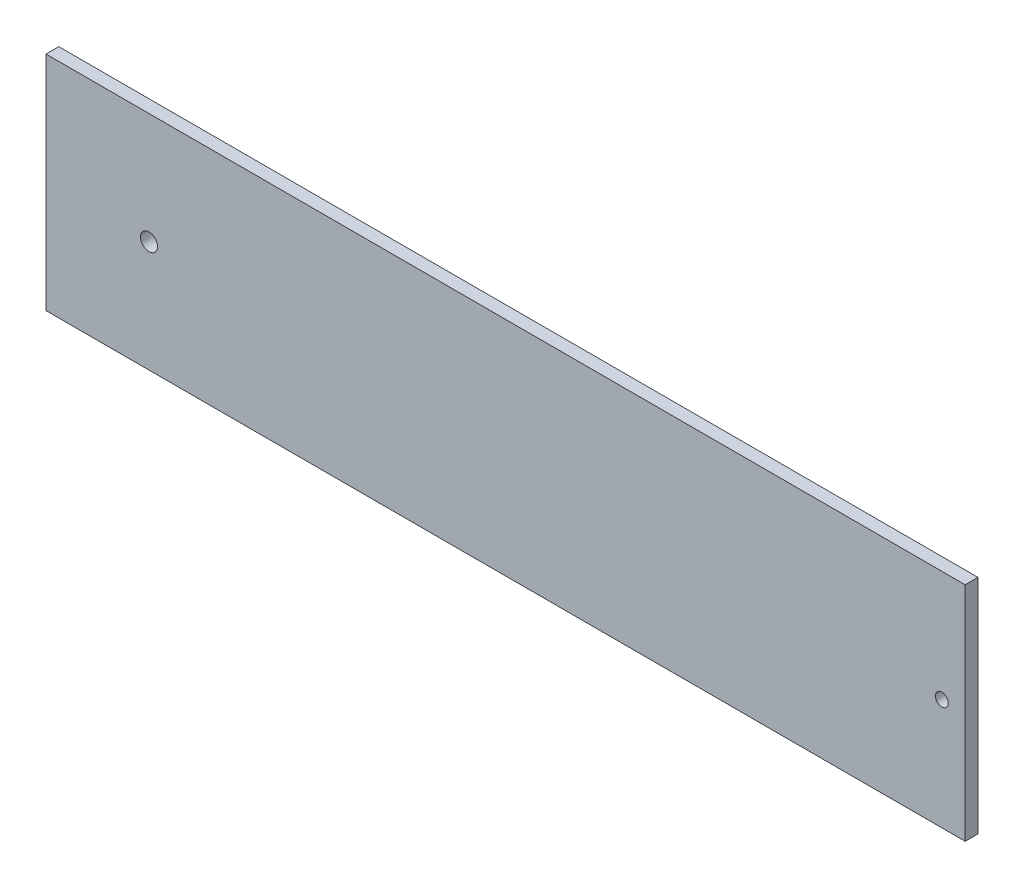
ISO-10303-21;
HEADER;
FILE_DESCRIPTION(('STEP AP214'),'2;1');
FILE_NAME('part.step','',(''),(''),'','','');
FILE_SCHEMA(('AUTOMOTIVE_DESIGN { 1 0 10303 214 1 1 1 1 }'));
ENDSEC;
DATA;
#1=APPLICATION_CONTEXT('core data for automotive mechanical design processes');
#2=APPLICATION_PROTOCOL_DEFINITION('international standard','automotive_design',2000,#1);
#3=PRODUCT_CONTEXT('',#1,'mechanical');
#4=PRODUCT('Part','Part','',(#3));
#5=PRODUCT_RELATED_PRODUCT_CATEGORY('part','',(#4));
#6=PRODUCT_DEFINITION_FORMATION('','',#4);
#7=PRODUCT_DEFINITION_CONTEXT('part definition',#1,'design');
#8=PRODUCT_DEFINITION('design','',#6,#7);
#9=PRODUCT_DEFINITION_SHAPE('','',#8);
#10=(LENGTH_UNIT() NAMED_UNIT(*) SI_UNIT(.MILLI.,.METRE.));
#11=(NAMED_UNIT(*) PLANE_ANGLE_UNIT() SI_UNIT($,.RADIAN.));
#12=(NAMED_UNIT(*) SI_UNIT($,.STERADIAN.) SOLID_ANGLE_UNIT());
#13=UNCERTAINTY_MEASURE_WITH_UNIT(LENGTH_MEASURE(1.E-05),#10,'distance_accuracy_value','');
#14=(GEOMETRIC_REPRESENTATION_CONTEXT(3) GLOBAL_UNCERTAINTY_ASSIGNED_CONTEXT((#13)) GLOBAL_UNIT_ASSIGNED_CONTEXT((#10,
#11,#12)) REPRESENTATION_CONTEXT('',''));
#15=CARTESIAN_POINT('',(0.,0.,0.));
#16=DIRECTION('',(0.,0.,1.));
#17=DIRECTION('',(1.,0.,0.));
#18=AXIS2_PLACEMENT_3D('',#15,#16,#17);
#19=CARTESIAN_POINT('',(-120.65,26.035,3.));
#20=DIRECTION('',(0.,-1.,0.));
#21=DIRECTION('',(0.,0.,-1.));
#22=AXIS2_PLACEMENT_3D('',#19,#20,#21);
#23=PLANE('',#22);
#24=DIRECTION('',(-1.,0.,0.));
#25=VECTOR('',#24,1.);
#26=CARTESIAN_POINT('',(-120.65,26.035,3.));
#27=LINE('',#26,#25);
#28=CARTESIAN_POINT('',(94.742,26.035,3.));
#29=VERTEX_POINT('',#28);
#30=CARTESIAN_POINT('',(-120.65,26.035,3.));
#31=VERTEX_POINT('',#30);
#32=EDGE_CURVE('E96',#29,#31,#27,.T.);
#33=ORIENTED_EDGE('',*,*,#32,.F.);
#34=DIRECTION('',(0.,0.,-1.));
#35=VECTOR('',#34,1.);
#36=CARTESIAN_POINT('',(94.742,26.035,3.));
#37=LINE('',#36,#35);
#38=CARTESIAN_POINT('',(94.742,26.035,0.));
#39=VERTEX_POINT('',#38);
#40=EDGE_CURVE('E126',#29,#39,#37,.T.);
#41=ORIENTED_EDGE('',*,*,#40,.T.);
#42=DIRECTION('',(-1.,0.,0.));
#43=VECTOR('',#42,1.);
#44=CARTESIAN_POINT('',(-120.65,26.035,0.));
#45=LINE('',#44,#43);
#46=CARTESIAN_POINT('',(-120.65,26.035,0.));
#47=VERTEX_POINT('',#46);
#48=EDGE_CURVE('E85',#39,#47,#45,.T.);
#49=ORIENTED_EDGE('',*,*,#48,.T.);
#50=DIRECTION('',(0.,0.,-1.));
#51=VECTOR('',#50,1.);
#52=CARTESIAN_POINT('',(-120.65,26.035,3.));
#53=LINE('',#52,#51);
#54=EDGE_CURVE('E11',#31,#47,#53,.T.);
#55=ORIENTED_EDGE('',*,*,#54,.F.);
#56=EDGE_LOOP('',(#33,#41,#49,#55));
#57=FACE_BOUND('',#56,.T.);
#58=ADVANCED_FACE('F39',(#57),#23,.F.);
#59=CARTESIAN_POINT('',(-120.65,-26.035,3.));
#60=DIRECTION('',(1.,0.,0.));
#61=DIRECTION('',(0.,0.,-1.));
#62=AXIS2_PLACEMENT_3D('',#59,#60,#61);
#63=PLANE('',#62);
#64=DIRECTION('',(0.,-1.,0.));
#65=VECTOR('',#64,1.);
#66=CARTESIAN_POINT('',(-120.65,-26.035,0.));
#67=LINE('',#66,#65);
#68=CARTESIAN_POINT('',(-120.65,-26.035,0.));
#69=VERTEX_POINT('',#68);
#70=EDGE_CURVE('E75',#47,#69,#67,.T.);
#71=ORIENTED_EDGE('',*,*,#70,.T.);
#72=DIRECTION('',(0.,0.,-1.));
#73=VECTOR('',#72,1.);
#74=CARTESIAN_POINT('',(-120.65,-26.035,3.));
#75=LINE('',#74,#73);
#76=CARTESIAN_POINT('',(-120.65,-26.035,3.));
#77=VERTEX_POINT('',#76);
#78=EDGE_CURVE('E47',#77,#69,#75,.T.);
#79=ORIENTED_EDGE('',*,*,#78,.F.);
#80=DIRECTION('',(0.,-1.,0.));
#81=VECTOR('',#80,1.);
#82=CARTESIAN_POINT('',(-120.65,-26.035,3.));
#83=LINE('',#82,#81);
#84=EDGE_CURVE('E63',#31,#77,#83,.T.);
#85=ORIENTED_EDGE('',*,*,#84,.F.);
#86=ORIENTED_EDGE('',*,*,#54,.T.);
#87=EDGE_LOOP('',(#71,#79,#85,#86));
#88=FACE_BOUND('',#87,.T.);
#89=ADVANCED_FACE('F77',(#88),#63,.F.);
#90=CARTESIAN_POINT('',(-120.65,-26.035,3.));
#91=DIRECTION('',(0.,1.,0.));
#92=DIRECTION('',(0.,0.,1.));
#93=AXIS2_PLACEMENT_3D('',#90,#91,#92);
#94=PLANE('',#93);
#95=DIRECTION('',(1.,0.,0.));
#96=VECTOR('',#95,1.);
#97=CARTESIAN_POINT('',(-120.65,-26.035,0.));
#98=LINE('',#97,#96);
#99=CARTESIAN_POINT('',(94.7419999999999,-26.035,0.));
#100=VERTEX_POINT('',#99);
#101=EDGE_CURVE('E84',#69,#100,#98,.T.);
#102=ORIENTED_EDGE('',*,*,#101,.T.);
#103=DIRECTION('',(0.,0.,-1.));
#104=VECTOR('',#103,1.);
#105=CARTESIAN_POINT('',(94.742,-26.035,3.));
#106=LINE('',#105,#104);
#107=CARTESIAN_POINT('',(94.742,-26.035,3.));
#108=VERTEX_POINT('',#107);
#109=EDGE_CURVE('E54',#108,#100,#106,.T.);
#110=ORIENTED_EDGE('',*,*,#109,.F.);
#111=DIRECTION('',(1.,0.,0.));
#112=VECTOR('',#111,1.);
#113=CARTESIAN_POINT('',(-120.65,-26.035,3.));
#114=LINE('',#113,#112);
#115=EDGE_CURVE('E90',#77,#108,#114,.T.);
#116=ORIENTED_EDGE('',*,*,#115,.F.);
#117=ORIENTED_EDGE('',*,*,#78,.T.);
#118=EDGE_LOOP('',(#102,#110,#116,#117));
#119=FACE_BOUND('',#118,.T.);
#120=ADVANCED_FACE('F89',(#119),#94,.F.);
#121=CARTESIAN_POINT('',(0.,0.,3.));
#122=DIRECTION('',(0.,0.,-1.));
#123=DIRECTION('',(-1.,0.,0.));
#124=AXIS2_PLACEMENT_3D('',#121,#122,#123);
#125=PLANE('',#124);
#126=CARTESIAN_POINT('',(89.267430612038,0.,3.));
#127=DIRECTION('',(0.,0.,1.));
#128=DIRECTION('',(1.,0.,0.));
#129=AXIS2_PLACEMENT_3D('',#126,#127,#128);
#130=CIRCLE('',#129,1.5);
#131=CARTESIAN_POINT('',(90.767430612038,0.,3.));
#132=VERTEX_POINT('',#131);
#133=EDGE_CURVE('E116',#132,#132,#130,.T.);
#134=ORIENTED_EDGE('',*,*,#133,.F.);
#135=EDGE_LOOP('',(#134));
#136=FACE_BOUND('',#135,.T.);
#137=CARTESIAN_POINT('',(-96.52,0.,3.));
#138=DIRECTION('',(0.,0.,1.));
#139=DIRECTION('',(1.,0.,0.));
#140=AXIS2_PLACEMENT_3D('',#137,#138,#139);
#141=CIRCLE('',#140,2.);
#142=CARTESIAN_POINT('',(-94.52,0.,3.));
#143=VERTEX_POINT('',#142);
#144=EDGE_CURVE('E108',#143,#143,#141,.T.);
#145=ORIENTED_EDGE('',*,*,#144,.F.);
#146=EDGE_LOOP('',(#145));
#147=FACE_BOUND('',#146,.T.);
#148=ORIENTED_EDGE('',*,*,#115,.T.);
#149=DIRECTION('',(0.,-1.,0.));
#150=VECTOR('',#149,1.);
#151=CARTESIAN_POINT('',(94.742,26.035,3.));
#152=LINE('',#151,#150);
#153=EDGE_CURVE('E120',#29,#108,#152,.T.);
#154=ORIENTED_EDGE('',*,*,#153,.F.);
#155=ORIENTED_EDGE('',*,*,#32,.T.);
#156=ORIENTED_EDGE('',*,*,#84,.T.);
#157=EDGE_LOOP('',(#148,#154,#155,#156));
#158=FACE_BOUND('',#157,.T.);
#159=ADVANCED_FACE('F142',(#136,#147,#158),#125,.F.);
#160=CARTESIAN_POINT('',(0.,0.,0.));
#161=DIRECTION('',(0.,0.,-1.));
#162=DIRECTION('',(-1.,0.,0.));
#163=AXIS2_PLACEMENT_3D('',#160,#161,#162);
#164=PLANE('',#163);
#165=DIRECTION('',(0.,-1.,0.));
#166=VECTOR('',#165,1.);
#167=CARTESIAN_POINT('',(94.742,26.035,0.));
#168=LINE('',#167,#166);
#169=EDGE_CURVE('E94',#39,#100,#168,.T.);
#170=ORIENTED_EDGE('',*,*,#169,.T.);
#171=ORIENTED_EDGE('',*,*,#101,.F.);
#172=ORIENTED_EDGE('',*,*,#70,.F.);
#173=ORIENTED_EDGE('',*,*,#48,.F.);
#174=EDGE_LOOP('',(#170,#171,#172,#173));
#175=FACE_BOUND('',#174,.T.);
#176=CARTESIAN_POINT('',(89.267430612038,0.,0.));
#177=DIRECTION('',(0.,0.,1.));
#178=DIRECTION('',(1.,0.,0.));
#179=AXIS2_PLACEMENT_3D('',#176,#177,#178);
#180=CIRCLE('',#179,1.5);
#181=CARTESIAN_POINT('',(90.767430612038,0.,0.));
#182=VERTEX_POINT('',#181);
#183=EDGE_CURVE('E112',#182,#182,#180,.T.);
#184=ORIENTED_EDGE('',*,*,#183,.T.);
#185=EDGE_LOOP('',(#184));
#186=FACE_BOUND('',#185,.T.);
#187=CARTESIAN_POINT('',(-96.52,0.,0.));
#188=DIRECTION('',(0.,0.,1.));
#189=DIRECTION('',(1.,0.,0.));
#190=AXIS2_PLACEMENT_3D('',#187,#188,#189);
#191=CIRCLE('',#190,2.);
#192=CARTESIAN_POINT('',(-94.52,0.,0.));
#193=VERTEX_POINT('',#192);
#194=EDGE_CURVE('E103',#193,#193,#191,.T.);
#195=ORIENTED_EDGE('',*,*,#194,.T.);
#196=EDGE_LOOP('',(#195));
#197=FACE_BOUND('',#196,.T.);
#198=ADVANCED_FACE('F92',(#175,#186,#197),#164,.T.);
#199=CARTESIAN_POINT('',(-96.52,0.,0.));
#200=DIRECTION('',(0.,0.,1.));
#201=DIRECTION('',(1.,0.,0.));
#202=AXIS2_PLACEMENT_3D('',#199,#200,#201);
#203=CYLINDRICAL_SURFACE('',#202,2.);
#204=ORIENTED_EDGE('',*,*,#194,.F.);
#205=EDGE_LOOP('',(#204));
#206=FACE_BOUND('',#205,.T.);
#207=ORIENTED_EDGE('',*,*,#144,.T.);
#208=EDGE_LOOP('',(#207));
#209=FACE_BOUND('',#208,.T.);
#210=ADVANCED_FACE('F150',(#206,#209),#203,.F.);
#211=CARTESIAN_POINT('',(89.267430612038,0.,0.));
#212=DIRECTION('',(0.,0.,1.));
#213=DIRECTION('',(1.,0.,0.));
#214=AXIS2_PLACEMENT_3D('',#211,#212,#213);
#215=CYLINDRICAL_SURFACE('',#214,1.5);
#216=ORIENTED_EDGE('',*,*,#183,.F.);
#217=EDGE_LOOP('',(#216));
#218=FACE_BOUND('',#217,.T.);
#219=ORIENTED_EDGE('',*,*,#133,.T.);
#220=EDGE_LOOP('',(#219));
#221=FACE_BOUND('',#220,.T.);
#222=ADVANCED_FACE('F190',(#218,#221),#215,.F.);
#223=CARTESIAN_POINT('',(94.742,0.,0.));
#224=DIRECTION('',(-1.,0.,0.));
#225=DIRECTION('',(0.,0.,1.));
#226=AXIS2_PLACEMENT_3D('',#223,#224,#225);
#227=PLANE('',#226);
#228=ORIENTED_EDGE('',*,*,#109,.T.);
#229=ORIENTED_EDGE('',*,*,#169,.F.);
#230=ORIENTED_EDGE('',*,*,#40,.F.);
#231=ORIENTED_EDGE('',*,*,#153,.T.);
#232=EDGE_LOOP('',(#228,#229,#230,#231));
#233=FACE_BOUND('',#232,.T.);
#234=ADVANCED_FACE('F140',(#233),#227,.F.);
#235=CLOSED_SHELL('',(#58,#89,#120,#159,#198,#210,#222,#234));
#236=MANIFOLD_SOLID_BREP('B2',#235);
#237=ADVANCED_BREP_SHAPE_REPRESENTATION('',(#18,#236),#14);
#238=SHAPE_DEFINITION_REPRESENTATION(#9,#237);
ENDSEC;
END-ISO-10303-21;
